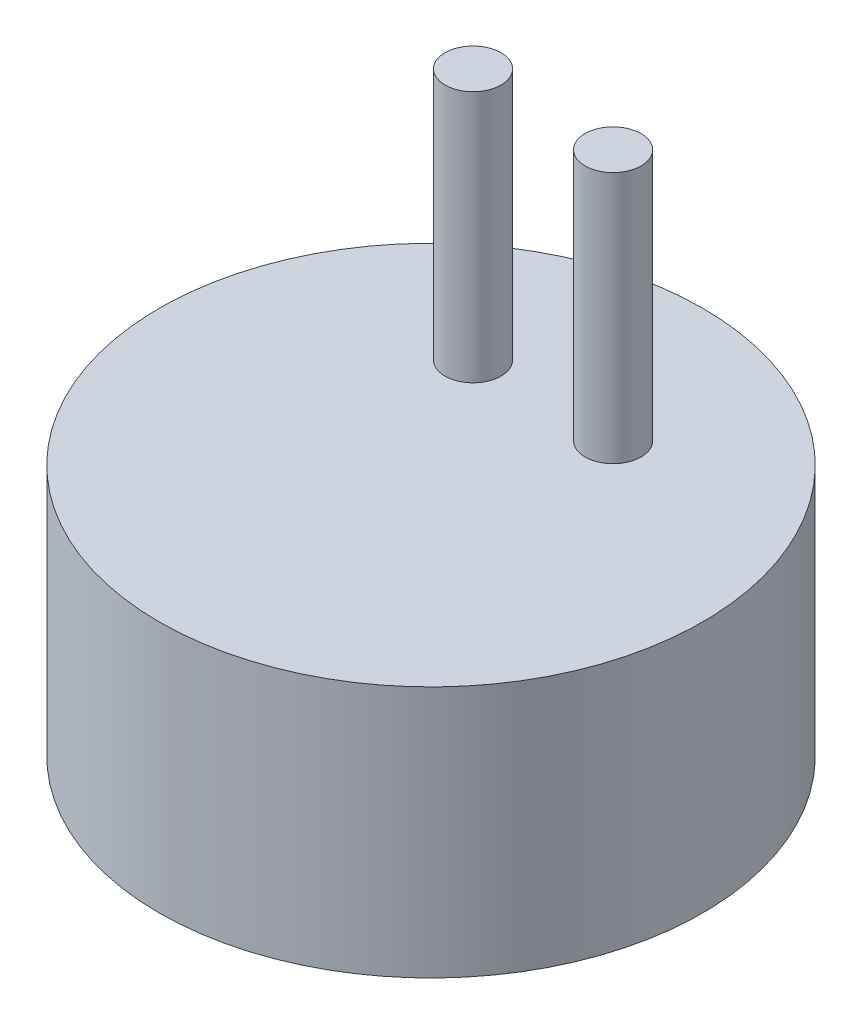
ISO-10303-21;
HEADER;
FILE_DESCRIPTION(('STEP AP214'),'2;1');
FILE_NAME('part.step','',(''),(''),'','','');
FILE_SCHEMA(('AUTOMOTIVE_DESIGN { 1 0 10303 214 1 1 1 1 }'));
ENDSEC;
DATA;
#1=APPLICATION_CONTEXT('core data for automotive mechanical design processes');
#2=APPLICATION_PROTOCOL_DEFINITION('international standard','automotive_design',2000,#1);
#3=PRODUCT_CONTEXT('',#1,'mechanical');
#4=PRODUCT('Part','Part','',(#3));
#5=PRODUCT_RELATED_PRODUCT_CATEGORY('part','',(#4));
#6=PRODUCT_DEFINITION_FORMATION('','',#4);
#7=PRODUCT_DEFINITION_CONTEXT('part definition',#1,'design');
#8=PRODUCT_DEFINITION('design','',#6,#7);
#9=PRODUCT_DEFINITION_SHAPE('','',#8);
#10=(LENGTH_UNIT() NAMED_UNIT(*) SI_UNIT(.MILLI.,.METRE.));
#11=(NAMED_UNIT(*) PLANE_ANGLE_UNIT() SI_UNIT($,.RADIAN.));
#12=(NAMED_UNIT(*) SI_UNIT($,.STERADIAN.) SOLID_ANGLE_UNIT());
#13=UNCERTAINTY_MEASURE_WITH_UNIT(LENGTH_MEASURE(1.E-05),#10,'distance_accuracy_value','');
#14=(GEOMETRIC_REPRESENTATION_CONTEXT(3) GLOBAL_UNCERTAINTY_ASSIGNED_CONTEXT((#13)) GLOBAL_UNIT_ASSIGNED_CONTEXT((#10,
#11,#12)) REPRESENTATION_CONTEXT('',''));
#15=CARTESIAN_POINT('',(0.,0.,0.));
#16=DIRECTION('',(0.,0.,1.));
#17=DIRECTION('',(1.,0.,0.));
#18=AXIS2_PLACEMENT_3D('',#15,#16,#17);
#19=CARTESIAN_POINT('',(0.,4.5,0.));
#20=DIRECTION('',(0.,-1.,0.));
#21=DIRECTION('',(0.,0.,-1.));
#22=AXIS2_PLACEMENT_3D('',#19,#20,#21);
#23=CYLINDRICAL_SURFACE('',#22,4.85);
#24=CARTESIAN_POINT('',(0.,4.5,0.));
#25=DIRECTION('',(0.,1.,0.));
#26=DIRECTION('',(0.,0.,1.));
#27=AXIS2_PLACEMENT_3D('',#24,#25,#26);
#28=CIRCLE('',#27,4.85);
#29=CARTESIAN_POINT('',(0.,4.5,4.85));
#30=VERTEX_POINT('',#29);
#31=EDGE_CURVE('E10',#30,#30,#28,.T.);
#32=ORIENTED_EDGE('',*,*,#31,.F.);
#33=EDGE_LOOP('',(#32));
#34=FACE_BOUND('',#33,.T.);
#35=CARTESIAN_POINT('',(0.,0.,0.));
#36=DIRECTION('',(0.,1.,0.));
#37=DIRECTION('',(0.,0.,1.));
#38=AXIS2_PLACEMENT_3D('',#35,#36,#37);
#39=CIRCLE('',#38,4.85);
#40=CARTESIAN_POINT('',(0.,0.,4.85));
#41=VERTEX_POINT('',#40);
#42=EDGE_CURVE('E36',#41,#41,#39,.T.);
#43=ORIENTED_EDGE('',*,*,#42,.T.);
#44=EDGE_LOOP('',(#43));
#45=FACE_BOUND('',#44,.T.);
#46=ADVANCED_FACE('F33',(#34,#45),#23,.T.);
#47=CARTESIAN_POINT('',(0.,4.5,0.));
#48=DIRECTION('',(0.,1.,0.));
#49=DIRECTION('',(0.,0.,1.));
#50=AXIS2_PLACEMENT_3D('',#47,#48,#49);
#51=PLANE('',#50);
#52=CARTESIAN_POINT('',(-1.25,4.5,-2.));
#53=DIRECTION('',(0.,1.,0.));
#54=DIRECTION('',(0.,0.,1.));
#55=AXIS2_PLACEMENT_3D('',#52,#53,#54);
#56=CIRCLE('',#55,0.5);
#57=CARTESIAN_POINT('',(-1.25,4.5,-1.5));
#58=VERTEX_POINT('',#57);
#59=EDGE_CURVE('E51',#58,#58,#56,.T.);
#60=ORIENTED_EDGE('',*,*,#59,.F.);
#61=EDGE_LOOP('',(#60));
#62=FACE_BOUND('',#61,.T.);
#63=CARTESIAN_POINT('',(1.25,4.5,-2.));
#64=DIRECTION('',(0.,1.,0.));
#65=DIRECTION('',(0.,0.,1.));
#66=AXIS2_PLACEMENT_3D('',#63,#64,#65);
#67=CIRCLE('',#66,0.5);
#68=CARTESIAN_POINT('',(1.25,4.5,-1.5));
#69=VERTEX_POINT('',#68);
#70=EDGE_CURVE('E45',#69,#69,#67,.T.);
#71=ORIENTED_EDGE('',*,*,#70,.F.);
#72=EDGE_LOOP('',(#71));
#73=FACE_BOUND('',#72,.T.);
#74=ORIENTED_EDGE('',*,*,#31,.T.);
#75=EDGE_LOOP('',(#74));
#76=FACE_BOUND('',#75,.T.);
#77=ADVANCED_FACE('F66',(#62,#73,#76),#51,.T.);
#78=CARTESIAN_POINT('',(0.,0.,0.));
#79=DIRECTION('',(0.,1.,0.));
#80=DIRECTION('',(0.,0.,1.));
#81=AXIS2_PLACEMENT_3D('',#78,#79,#80);
#82=PLANE('',#81);
#83=ORIENTED_EDGE('',*,*,#42,.F.);
#84=EDGE_LOOP('',(#83));
#85=FACE_BOUND('',#84,.T.);
#86=ADVANCED_FACE('F69',(#85),#82,.F.);
#87=CARTESIAN_POINT('',(1.25,9.,-2.));
#88=DIRECTION('',(0.,-1.,0.));
#89=DIRECTION('',(0.,0.,-1.));
#90=AXIS2_PLACEMENT_3D('',#87,#88,#89);
#91=CYLINDRICAL_SURFACE('',#90,0.5);
#92=CARTESIAN_POINT('',(1.25,9.,-2.));
#93=DIRECTION('',(0.,1.,0.));
#94=DIRECTION('',(0.,0.,1.));
#95=AXIS2_PLACEMENT_3D('',#92,#93,#94);
#96=CIRCLE('',#95,0.5);
#97=CARTESIAN_POINT('',(1.25,9.,-1.5));
#98=VERTEX_POINT('',#97);
#99=EDGE_CURVE('E43',#98,#98,#96,.T.);
#100=ORIENTED_EDGE('',*,*,#99,.F.);
#101=EDGE_LOOP('',(#100));
#102=FACE_BOUND('',#101,.T.);
#103=ORIENTED_EDGE('',*,*,#70,.T.);
#104=EDGE_LOOP('',(#103));
#105=FACE_BOUND('',#104,.T.);
#106=ADVANCED_FACE('F73',(#102,#105),#91,.T.);
#107=CARTESIAN_POINT('',(1.25,9.,-2.));
#108=DIRECTION('',(0.,1.,0.));
#109=DIRECTION('',(0.,0.,1.));
#110=AXIS2_PLACEMENT_3D('',#107,#108,#109);
#111=PLANE('',#110);
#112=ORIENTED_EDGE('',*,*,#99,.T.);
#113=EDGE_LOOP('',(#112));
#114=FACE_BOUND('',#113,.T.);
#115=ADVANCED_FACE('F62',(#114),#111,.T.);
#116=CARTESIAN_POINT('',(-1.25,9.,-2.));
#117=DIRECTION('',(0.,-1.,0.));
#118=DIRECTION('',(0.,0.,-1.));
#119=AXIS2_PLACEMENT_3D('',#116,#117,#118);
#120=CYLINDRICAL_SURFACE('',#119,0.5);
#121=CARTESIAN_POINT('',(-1.25,9.,-2.));
#122=DIRECTION('',(0.,1.,0.));
#123=DIRECTION('',(0.,0.,1.));
#124=AXIS2_PLACEMENT_3D('',#121,#122,#123);
#125=CIRCLE('',#124,0.5);
#126=CARTESIAN_POINT('',(-1.25,9.,-1.5));
#127=VERTEX_POINT('',#126);
#128=EDGE_CURVE('E48',#127,#127,#125,.T.);
#129=ORIENTED_EDGE('',*,*,#128,.F.);
#130=EDGE_LOOP('',(#129));
#131=FACE_BOUND('',#130,.T.);
#132=ORIENTED_EDGE('',*,*,#59,.T.);
#133=EDGE_LOOP('',(#132));
#134=FACE_BOUND('',#133,.T.);
#135=ADVANCED_FACE('F59',(#131,#134),#120,.T.);
#136=CARTESIAN_POINT('',(-1.25,9.,-2.));
#137=DIRECTION('',(0.,1.,0.));
#138=DIRECTION('',(0.,0.,1.));
#139=AXIS2_PLACEMENT_3D('',#136,#137,#138);
#140=PLANE('',#139);
#141=ORIENTED_EDGE('',*,*,#128,.T.);
#142=EDGE_LOOP('',(#141));
#143=FACE_BOUND('',#142,.T.);
#144=ADVANCED_FACE('F57',(#143),#140,.T.);
#145=CLOSED_SHELL('',(#46,#77,#86,#106,#115,#135,#144));
#146=MANIFOLD_SOLID_BREP('B2',#145);
#147=ADVANCED_BREP_SHAPE_REPRESENTATION('',(#18,#146),#14);
#148=SHAPE_DEFINITION_REPRESENTATION(#9,#147);
ENDSEC;
END-ISO-10303-21;
